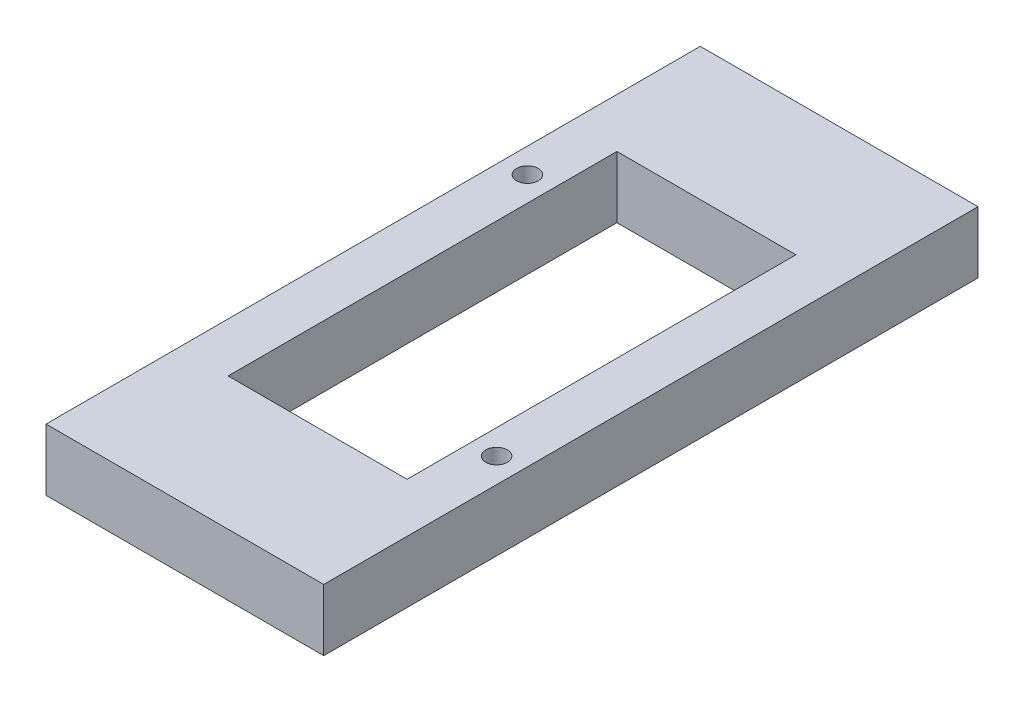
ISO-10303-21;
HEADER;
FILE_DESCRIPTION(('STEP AP214'),'2;1');
FILE_NAME('part.step','',(''),(''),'','','');
FILE_SCHEMA(('AUTOMOTIVE_DESIGN { 1 0 10303 214 1 1 1 1 }'));
ENDSEC;
DATA;
#1=APPLICATION_CONTEXT('core data for automotive mechanical design processes');
#2=APPLICATION_PROTOCOL_DEFINITION('international standard','automotive_design',2000,#1);
#3=PRODUCT_CONTEXT('',#1,'mechanical');
#4=PRODUCT('Part','Part','',(#3));
#5=PRODUCT_RELATED_PRODUCT_CATEGORY('part','',(#4));
#6=PRODUCT_DEFINITION_FORMATION('','',#4);
#7=PRODUCT_DEFINITION_CONTEXT('part definition',#1,'design');
#8=PRODUCT_DEFINITION('design','',#6,#7);
#9=PRODUCT_DEFINITION_SHAPE('','',#8);
#10=(LENGTH_UNIT() NAMED_UNIT(*) SI_UNIT(.MILLI.,.METRE.));
#11=(NAMED_UNIT(*) PLANE_ANGLE_UNIT() SI_UNIT($,.RADIAN.));
#12=(NAMED_UNIT(*) SI_UNIT($,.STERADIAN.) SOLID_ANGLE_UNIT());
#13=UNCERTAINTY_MEASURE_WITH_UNIT(LENGTH_MEASURE(1.E-05),#10,'distance_accuracy_value','');
#14=(GEOMETRIC_REPRESENTATION_CONTEXT(3) GLOBAL_UNCERTAINTY_ASSIGNED_CONTEXT((#13)) GLOBAL_UNIT_ASSIGNED_CONTEXT((#10,
#11,#12)) REPRESENTATION_CONTEXT('',''));
#15=CARTESIAN_POINT('',(0.,0.,0.));
#16=DIRECTION('',(0.,0.,1.));
#17=DIRECTION('',(1.,0.,0.));
#18=AXIS2_PLACEMENT_3D('',#15,#16,#17);
#19=CARTESIAN_POINT('',(0.,10.,0.));
#20=DIRECTION('',(0.,1.,0.));
#21=DIRECTION('',(0.,0.,1.));
#22=AXIS2_PLACEMENT_3D('',#19,#20,#21);
#23=PLANE('',#22);
#24=CARTESIAN_POINT('',(4.,10.,32.));
#25=DIRECTION('',(0.,1.,0.));
#26=DIRECTION('',(0.,0.,1.));
#27=AXIS2_PLACEMENT_3D('',#24,#25,#26);
#28=CIRCLE('',#27,1.75);
#29=CARTESIAN_POINT('',(4.,10.,33.75));
#30=VERTEX_POINT('',#29);
#31=EDGE_CURVE('E124',#30,#30,#28,.T.);
#32=ORIENTED_EDGE('',*,*,#31,.F.);
#33=EDGE_LOOP('',(#32));
#34=FACE_BOUND('',#33,.T.);
#35=DIRECTION('',(0.,0.,1.));
#36=VECTOR('',#35,1.);
#37=CARTESIAN_POINT('',(0.,10.,0.));
#38=LINE('',#37,#36);
#39=CARTESIAN_POINT('',(0.,10.,0.));
#40=VERTEX_POINT('',#39);
#41=CARTESIAN_POINT('',(0.,10.,106.));
#42=VERTEX_POINT('',#41);
#43=EDGE_CURVE('E134',#40,#42,#38,.T.);
#44=ORIENTED_EDGE('',*,*,#43,.T.);
#45=DIRECTION('',(1.,0.,0.));
#46=VECTOR('',#45,1.);
#47=CARTESIAN_POINT('',(0.,10.,106.));
#48=LINE('',#47,#46);
#49=CARTESIAN_POINT('',(45.,10.,106.));
#50=VERTEX_POINT('',#49);
#51=EDGE_CURVE('E137',#42,#50,#48,.T.);
#52=ORIENTED_EDGE('',*,*,#51,.T.);
#53=DIRECTION('',(0.,0.,-1.));
#54=VECTOR('',#53,1.);
#55=CARTESIAN_POINT('',(45.,10.,0.));
#56=LINE('',#55,#54);
#57=CARTESIAN_POINT('',(45.,10.,0.));
#58=VERTEX_POINT('',#57);
#59=EDGE_CURVE('E140',#50,#58,#56,.T.);
#60=ORIENTED_EDGE('',*,*,#59,.T.);
#61=DIRECTION('',(-1.,0.,0.));
#62=VECTOR('',#61,1.);
#63=CARTESIAN_POINT('',(0.,10.,0.));
#64=LINE('',#63,#62);
#65=EDGE_CURVE('E142',#58,#40,#64,.T.);
#66=ORIENTED_EDGE('',*,*,#65,.T.);
#67=EDGE_LOOP('',(#44,#52,#60,#66));
#68=FACE_BOUND('',#67,.T.);
#69=DIRECTION('',(1.,0.,0.));
#70=VECTOR('',#69,1.);
#71=CARTESIAN_POINT('',(8.00000000000001,10.,84.5));
#72=LINE('',#71,#70);
#73=CARTESIAN_POINT('',(8.00000000000001,10.,84.5));
#74=VERTEX_POINT('',#73);
#75=CARTESIAN_POINT('',(37.,10.,84.5));
#76=VERTEX_POINT('',#75);
#77=EDGE_CURVE('E103',#74,#76,#72,.T.);
#78=ORIENTED_EDGE('',*,*,#77,.F.);
#79=DIRECTION('',(0.,0.,1.));
#80=VECTOR('',#79,1.);
#81=CARTESIAN_POINT('',(8.,10.,21.5));
#82=LINE('',#81,#80);
#83=CARTESIAN_POINT('',(8.,10.,21.5));
#84=VERTEX_POINT('',#83);
#85=EDGE_CURVE('E95',#84,#74,#82,.T.);
#86=ORIENTED_EDGE('',*,*,#85,.F.);
#87=DIRECTION('',(-1.,0.,0.));
#88=VECTOR('',#87,1.);
#89=CARTESIAN_POINT('',(8.,10.,21.5));
#90=LINE('',#89,#88);
#91=CARTESIAN_POINT('',(37.,10.,21.5));
#92=VERTEX_POINT('',#91);
#93=EDGE_CURVE('E118',#92,#84,#90,.T.);
#94=ORIENTED_EDGE('',*,*,#93,.F.);
#95=DIRECTION('',(0.,0.,-1.));
#96=VECTOR('',#95,1.);
#97=CARTESIAN_POINT('',(37.,10.,21.5));
#98=LINE('',#97,#96);
#99=EDGE_CURVE('E116',#76,#92,#98,.T.);
#100=ORIENTED_EDGE('',*,*,#99,.F.);
#101=EDGE_LOOP('',(#78,#86,#94,#100));
#102=FACE_BOUND('',#101,.T.);
#103=CARTESIAN_POINT('',(41.,10.,74.));
#104=DIRECTION('',(0.,1.,0.));
#105=DIRECTION('',(0.,0.,1.));
#106=AXIS2_PLACEMENT_3D('',#103,#104,#105);
#107=CIRCLE('',#106,1.75);
#108=CARTESIAN_POINT('',(41.,10.,75.75));
#109=VERTEX_POINT('',#108);
#110=EDGE_CURVE('E224',#109,#109,#107,.T.);
#111=ORIENTED_EDGE('',*,*,#110,.F.);
#112=EDGE_LOOP('',(#111));
#113=FACE_BOUND('',#112,.T.);
#114=ADVANCED_FACE('F30',(#34,#68,#102,#113),#23,.T.);
#115=CARTESIAN_POINT('',(0.,0.,0.));
#116=DIRECTION('',(0.,1.,0.));
#117=DIRECTION('',(0.,0.,1.));
#118=AXIS2_PLACEMENT_3D('',#115,#116,#117);
#119=PLANE('',#118);
#120=DIRECTION('',(0.,0.,1.));
#121=VECTOR('',#120,1.);
#122=CARTESIAN_POINT('',(0.,0.,0.));
#123=LINE('',#122,#121);
#124=CARTESIAN_POINT('',(0.,0.,0.));
#125=VERTEX_POINT('',#124);
#126=CARTESIAN_POINT('',(0.,0.,106.));
#127=VERTEX_POINT('',#126);
#128=EDGE_CURVE('E111',#125,#127,#123,.T.);
#129=ORIENTED_EDGE('',*,*,#128,.F.);
#130=DIRECTION('',(-1.,0.,0.));
#131=VECTOR('',#130,1.);
#132=CARTESIAN_POINT('',(0.,0.,0.));
#133=LINE('',#132,#131);
#134=CARTESIAN_POINT('',(45.,0.,0.));
#135=VERTEX_POINT('',#134);
#136=EDGE_CURVE('E138',#135,#125,#133,.T.);
#137=ORIENTED_EDGE('',*,*,#136,.F.);
#138=DIRECTION('',(0.,0.,-1.));
#139=VECTOR('',#138,1.);
#140=CARTESIAN_POINT('',(45.,0.,0.));
#141=LINE('',#140,#139);
#142=CARTESIAN_POINT('',(45.,0.,106.));
#143=VERTEX_POINT('',#142);
#144=EDGE_CURVE('E149',#143,#135,#141,.T.);
#145=ORIENTED_EDGE('',*,*,#144,.F.);
#146=DIRECTION('',(1.,0.,0.));
#147=VECTOR('',#146,1.);
#148=CARTESIAN_POINT('',(0.,0.,106.));
#149=LINE('',#148,#147);
#150=EDGE_CURVE('E147',#127,#143,#149,.T.);
#151=ORIENTED_EDGE('',*,*,#150,.F.);
#152=EDGE_LOOP('',(#129,#137,#145,#151));
#153=FACE_BOUND('',#152,.T.);
#154=DIRECTION('',(0.,0.,1.));
#155=VECTOR('',#154,1.);
#156=CARTESIAN_POINT('',(8.,0.,21.5));
#157=LINE('',#156,#155);
#158=CARTESIAN_POINT('',(8.,0.,21.5));
#159=VERTEX_POINT('',#158);
#160=CARTESIAN_POINT('',(8.00000000000001,0.,84.5));
#161=VERTEX_POINT('',#160);
#162=EDGE_CURVE('E53',#159,#161,#157,.T.);
#163=ORIENTED_EDGE('',*,*,#162,.T.);
#164=DIRECTION('',(1.,0.,0.));
#165=VECTOR('',#164,1.);
#166=CARTESIAN_POINT('',(8.00000000000001,0.,84.5));
#167=LINE('',#166,#165);
#168=CARTESIAN_POINT('',(37.,0.,84.5));
#169=VERTEX_POINT('',#168);
#170=EDGE_CURVE('E110',#161,#169,#167,.T.);
#171=ORIENTED_EDGE('',*,*,#170,.T.);
#172=DIRECTION('',(0.,0.,-1.));
#173=VECTOR('',#172,1.);
#174=CARTESIAN_POINT('',(37.,0.,21.5));
#175=LINE('',#174,#173);
#176=CARTESIAN_POINT('',(37.,0.,21.5));
#177=VERTEX_POINT('',#176);
#178=EDGE_CURVE('E126',#169,#177,#175,.T.);
#179=ORIENTED_EDGE('',*,*,#178,.T.);
#180=DIRECTION('',(-1.,0.,0.));
#181=VECTOR('',#180,1.);
#182=CARTESIAN_POINT('',(8.,0.,21.5));
#183=LINE('',#182,#181);
#184=EDGE_CURVE('E104',#177,#159,#183,.T.);
#185=ORIENTED_EDGE('',*,*,#184,.T.);
#186=EDGE_LOOP('',(#163,#171,#179,#185));
#187=FACE_BOUND('',#186,.T.);
#188=CARTESIAN_POINT('',(4.,0.,32.));
#189=DIRECTION('',(0.,1.,0.));
#190=DIRECTION('',(0.,0.,1.));
#191=AXIS2_PLACEMENT_3D('',#188,#189,#190);
#192=CIRCLE('',#191,1.75);
#193=CARTESIAN_POINT('',(4.,0.,33.75));
#194=VERTEX_POINT('',#193);
#195=EDGE_CURVE('E230',#194,#194,#192,.T.);
#196=ORIENTED_EDGE('',*,*,#195,.T.);
#197=EDGE_LOOP('',(#196));
#198=FACE_BOUND('',#197,.T.);
#199=CARTESIAN_POINT('',(41.,0.,74.));
#200=DIRECTION('',(0.,1.,0.));
#201=DIRECTION('',(0.,0.,1.));
#202=AXIS2_PLACEMENT_3D('',#199,#200,#201);
#203=CIRCLE('',#202,1.75);
#204=CARTESIAN_POINT('',(41.,0.,75.75));
#205=VERTEX_POINT('',#204);
#206=EDGE_CURVE('E227',#205,#205,#203,.T.);
#207=ORIENTED_EDGE('',*,*,#206,.T.);
#208=EDGE_LOOP('',(#207));
#209=FACE_BOUND('',#208,.T.);
#210=ADVANCED_FACE('F167',(#153,#187,#198,#209),#119,.F.);
#211=CARTESIAN_POINT('',(0.,10.,0.));
#212=DIRECTION('',(1.,0.,0.));
#213=DIRECTION('',(0.,0.,-1.));
#214=AXIS2_PLACEMENT_3D('',#211,#212,#213);
#215=PLANE('',#214);
#216=ORIENTED_EDGE('',*,*,#128,.T.);
#217=DIRECTION('',(0.,-1.,0.));
#218=VECTOR('',#217,1.);
#219=CARTESIAN_POINT('',(0.,10.,106.));
#220=LINE('',#219,#218);
#221=EDGE_CURVE('E11',#42,#127,#220,.T.);
#222=ORIENTED_EDGE('',*,*,#221,.F.);
#223=ORIENTED_EDGE('',*,*,#43,.F.);
#224=DIRECTION('',(0.,-1.,0.));
#225=VECTOR('',#224,1.);
#226=CARTESIAN_POINT('',(0.,10.,0.));
#227=LINE('',#226,#225);
#228=EDGE_CURVE('E144',#40,#125,#227,.T.);
#229=ORIENTED_EDGE('',*,*,#228,.T.);
#230=EDGE_LOOP('',(#216,#222,#223,#229));
#231=FACE_BOUND('',#230,.T.);
#232=ADVANCED_FACE('F32',(#231),#215,.F.);
#233=CARTESIAN_POINT('',(0.,10.,106.));
#234=DIRECTION('',(0.,0.,-1.));
#235=DIRECTION('',(-1.,0.,0.));
#236=AXIS2_PLACEMENT_3D('',#233,#234,#235);
#237=PLANE('',#236);
#238=ORIENTED_EDGE('',*,*,#150,.T.);
#239=DIRECTION('',(0.,-1.,0.));
#240=VECTOR('',#239,1.);
#241=CARTESIAN_POINT('',(45.,10.,106.));
#242=LINE('',#241,#240);
#243=EDGE_CURVE('E38',#50,#143,#242,.T.);
#244=ORIENTED_EDGE('',*,*,#243,.F.);
#245=ORIENTED_EDGE('',*,*,#51,.F.);
#246=ORIENTED_EDGE('',*,*,#221,.T.);
#247=EDGE_LOOP('',(#238,#244,#245,#246));
#248=FACE_BOUND('',#247,.T.);
#249=ADVANCED_FACE('F177',(#248),#237,.F.);
#250=CARTESIAN_POINT('',(45.,10.,0.));
#251=DIRECTION('',(-1.,0.,0.));
#252=DIRECTION('',(0.,0.,1.));
#253=AXIS2_PLACEMENT_3D('',#250,#251,#252);
#254=PLANE('',#253);
#255=ORIENTED_EDGE('',*,*,#144,.T.);
#256=DIRECTION('',(0.,-1.,0.));
#257=VECTOR('',#256,1.);
#258=CARTESIAN_POINT('',(45.,10.,0.));
#259=LINE('',#258,#257);
#260=EDGE_CURVE('E154',#58,#135,#259,.T.);
#261=ORIENTED_EDGE('',*,*,#260,.F.);
#262=ORIENTED_EDGE('',*,*,#59,.F.);
#263=ORIENTED_EDGE('',*,*,#243,.T.);
#264=EDGE_LOOP('',(#255,#261,#262,#263));
#265=FACE_BOUND('',#264,.T.);
#266=ADVANCED_FACE('F161',(#265),#254,.F.);
#267=CARTESIAN_POINT('',(0.,10.,0.));
#268=DIRECTION('',(0.,0.,1.));
#269=DIRECTION('',(1.,0.,0.));
#270=AXIS2_PLACEMENT_3D('',#267,#268,#269);
#271=PLANE('',#270);
#272=ORIENTED_EDGE('',*,*,#136,.T.);
#273=ORIENTED_EDGE('',*,*,#228,.F.);
#274=ORIENTED_EDGE('',*,*,#65,.F.);
#275=ORIENTED_EDGE('',*,*,#260,.T.);
#276=EDGE_LOOP('',(#272,#273,#274,#275));
#277=FACE_BOUND('',#276,.T.);
#278=ADVANCED_FACE('F171',(#277),#271,.F.);
#279=CARTESIAN_POINT('',(8.,10.,21.5));
#280=DIRECTION('',(1.,0.,0.));
#281=DIRECTION('',(0.,0.,-1.));
#282=AXIS2_PLACEMENT_3D('',#279,#280,#281);
#283=PLANE('',#282);
#284=ORIENTED_EDGE('',*,*,#162,.F.);
#285=DIRECTION('',(0.,-1.,0.));
#286=VECTOR('',#285,1.);
#287=CARTESIAN_POINT('',(8.,10.,21.5));
#288=LINE('',#287,#286);
#289=EDGE_CURVE('E99',#84,#159,#288,.T.);
#290=ORIENTED_EDGE('',*,*,#289,.F.);
#291=ORIENTED_EDGE('',*,*,#85,.T.);
#292=DIRECTION('',(0.,-1.,0.));
#293=VECTOR('',#292,1.);
#294=CARTESIAN_POINT('',(8.00000000000001,10.,84.5));
#295=LINE('',#294,#293);
#296=EDGE_CURVE('E98',#74,#161,#295,.T.);
#297=ORIENTED_EDGE('',*,*,#296,.T.);
#298=EDGE_LOOP('',(#284,#290,#291,#297));
#299=FACE_BOUND('',#298,.T.);
#300=ADVANCED_FACE('F97',(#299),#283,.T.);
#301=CARTESIAN_POINT('',(8.00000000000001,10.,84.5));
#302=DIRECTION('',(0.,0.,-1.));
#303=DIRECTION('',(-1.,0.,0.));
#304=AXIS2_PLACEMENT_3D('',#301,#302,#303);
#305=PLANE('',#304);
#306=ORIENTED_EDGE('',*,*,#170,.F.);
#307=ORIENTED_EDGE('',*,*,#296,.F.);
#308=ORIENTED_EDGE('',*,*,#77,.T.);
#309=DIRECTION('',(0.,-1.,0.));
#310=VECTOR('',#309,1.);
#311=CARTESIAN_POINT('',(37.,10.,84.5));
#312=LINE('',#311,#310);
#313=EDGE_CURVE('E112',#76,#169,#312,.T.);
#314=ORIENTED_EDGE('',*,*,#313,.T.);
#315=EDGE_LOOP('',(#306,#307,#308,#314));
#316=FACE_BOUND('',#315,.T.);
#317=ADVANCED_FACE('F107',(#316),#305,.T.);
#318=CARTESIAN_POINT('',(37.,10.,21.5));
#319=DIRECTION('',(-1.,0.,0.));
#320=DIRECTION('',(0.,0.,1.));
#321=AXIS2_PLACEMENT_3D('',#318,#319,#320);
#322=PLANE('',#321);
#323=ORIENTED_EDGE('',*,*,#178,.F.);
#324=ORIENTED_EDGE('',*,*,#313,.F.);
#325=ORIENTED_EDGE('',*,*,#99,.T.);
#326=DIRECTION('',(0.,-1.,0.));
#327=VECTOR('',#326,1.);
#328=CARTESIAN_POINT('',(37.,10.,21.5));
#329=LINE('',#328,#327);
#330=EDGE_CURVE('E45',#92,#177,#329,.T.);
#331=ORIENTED_EDGE('',*,*,#330,.T.);
#332=EDGE_LOOP('',(#323,#324,#325,#331));
#333=FACE_BOUND('',#332,.T.);
#334=ADVANCED_FACE('F202',(#333),#322,.T.);
#335=CARTESIAN_POINT('',(8.,10.,21.5));
#336=DIRECTION('',(0.,0.,1.));
#337=DIRECTION('',(1.,0.,0.));
#338=AXIS2_PLACEMENT_3D('',#335,#336,#337);
#339=PLANE('',#338);
#340=ORIENTED_EDGE('',*,*,#184,.F.);
#341=ORIENTED_EDGE('',*,*,#330,.F.);
#342=ORIENTED_EDGE('',*,*,#93,.T.);
#343=ORIENTED_EDGE('',*,*,#289,.T.);
#344=EDGE_LOOP('',(#340,#341,#342,#343));
#345=FACE_BOUND('',#344,.T.);
#346=ADVANCED_FACE('F206',(#345),#339,.T.);
#347=CARTESIAN_POINT('',(4.,10.,32.));
#348=DIRECTION('',(0.,-1.,0.));
#349=DIRECTION('',(0.,0.,-1.));
#350=AXIS2_PLACEMENT_3D('',#347,#348,#349);
#351=CYLINDRICAL_SURFACE('',#350,1.75);
#352=ORIENTED_EDGE('',*,*,#31,.T.);
#353=EDGE_LOOP('',(#352));
#354=FACE_BOUND('',#353,.T.);
#355=ORIENTED_EDGE('',*,*,#195,.F.);
#356=EDGE_LOOP('',(#355));
#357=FACE_BOUND('',#356,.T.);
#358=ADVANCED_FACE('F212',(#354,#357),#351,.F.);
#359=CARTESIAN_POINT('',(41.,10.,74.));
#360=DIRECTION('',(0.,-1.,0.));
#361=DIRECTION('',(0.,0.,-1.));
#362=AXIS2_PLACEMENT_3D('',#359,#360,#361);
#363=CYLINDRICAL_SURFACE('',#362,1.75);
#364=ORIENTED_EDGE('',*,*,#110,.T.);
#365=EDGE_LOOP('',(#364));
#366=FACE_BOUND('',#365,.T.);
#367=ORIENTED_EDGE('',*,*,#206,.F.);
#368=EDGE_LOOP('',(#367));
#369=FACE_BOUND('',#368,.T.);
#370=ADVANCED_FACE('F215',(#366,#369),#363,.F.);
#371=CLOSED_SHELL('',(#114,#210,#232,#249,#266,#278,#300,#317,#334,#346,#358,#370));
#372=MANIFOLD_SOLID_BREP('B2',#371);
#373=ADVANCED_BREP_SHAPE_REPRESENTATION('',(#18,#372),#14);
#374=SHAPE_DEFINITION_REPRESENTATION(#9,#373);
ENDSEC;
END-ISO-10303-21;
